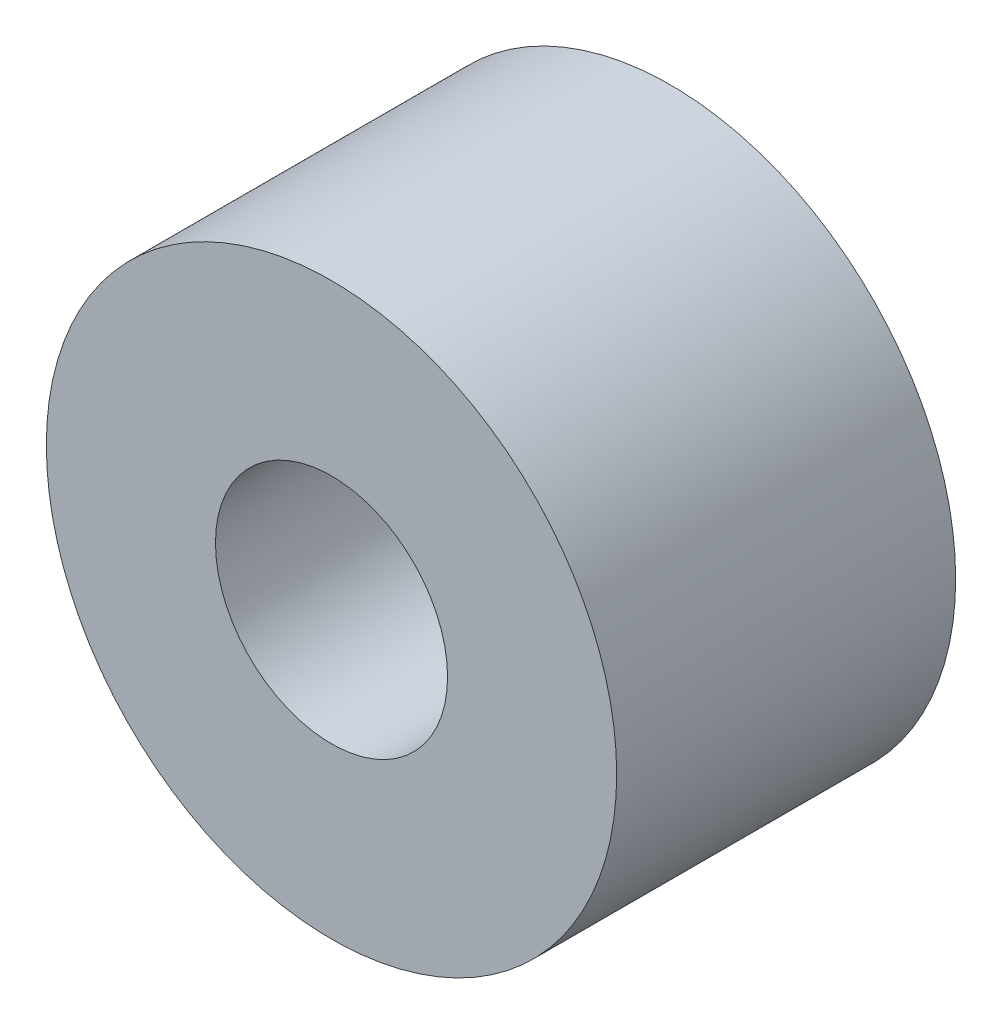
ISO-10303-21;
HEADER;
FILE_DESCRIPTION(('STEP AP214'),'2;1');
FILE_NAME('part.step','',(''),(''),'','','');
FILE_SCHEMA(('AUTOMOTIVE_DESIGN { 1 0 10303 214 1 1 1 1 }'));
ENDSEC;
DATA;
#1=APPLICATION_CONTEXT('core data for automotive mechanical design processes');
#2=APPLICATION_PROTOCOL_DEFINITION('international standard','automotive_design',2000,#1);
#3=PRODUCT_CONTEXT('',#1,'mechanical');
#4=PRODUCT('Part','Part','',(#3));
#5=PRODUCT_RELATED_PRODUCT_CATEGORY('part','',(#4));
#6=PRODUCT_DEFINITION_FORMATION('','',#4);
#7=PRODUCT_DEFINITION_CONTEXT('part definition',#1,'design');
#8=PRODUCT_DEFINITION('design','',#6,#7);
#9=PRODUCT_DEFINITION_SHAPE('','',#8);
#10=(LENGTH_UNIT() NAMED_UNIT(*) SI_UNIT(.MILLI.,.METRE.));
#11=(NAMED_UNIT(*) PLANE_ANGLE_UNIT() SI_UNIT($,.RADIAN.));
#12=(NAMED_UNIT(*) SI_UNIT($,.STERADIAN.) SOLID_ANGLE_UNIT());
#13=UNCERTAINTY_MEASURE_WITH_UNIT(LENGTH_MEASURE(1.E-05),#10,'distance_accuracy_value','');
#14=(GEOMETRIC_REPRESENTATION_CONTEXT(3) GLOBAL_UNCERTAINTY_ASSIGNED_CONTEXT((#13)) GLOBAL_UNIT_ASSIGNED_CONTEXT((#10,
#11,#12)) REPRESENTATION_CONTEXT('',''));
#15=CARTESIAN_POINT('',(0.,0.,0.));
#16=DIRECTION('',(0.,0.,1.));
#17=DIRECTION('',(1.,0.,0.));
#18=AXIS2_PLACEMENT_3D('',#15,#16,#17);
#19=CARTESIAN_POINT('',(0.,0.,9.01700000000009));
#20=DIRECTION('',(0.,0.,-1.));
#21=DIRECTION('',(-1.,0.,0.));
#22=AXIS2_PLACEMENT_3D('',#19,#20,#21);
#23=CYLINDRICAL_SURFACE('',#22,2.);
#24=CARTESIAN_POINT('',(0.,0.,9.01700000000009));
#25=DIRECTION('',(0.,0.,1.));
#26=DIRECTION('',(1.,0.,0.));
#27=AXIS2_PLACEMENT_3D('',#24,#25,#26);
#28=CIRCLE('',#27,2.);
#29=CARTESIAN_POINT('',(2.,0.,9.01700000000009));
#30=VERTEX_POINT('',#29);
#31=EDGE_CURVE('E40',#30,#30,#28,.T.);
#32=ORIENTED_EDGE('',*,*,#31,.T.);
#33=EDGE_LOOP('',(#32));
#34=FACE_BOUND('',#33,.T.);
#35=CARTESIAN_POINT('',(0.,0.,3.17500000000009));
#36=DIRECTION('',(0.,0.,1.));
#37=DIRECTION('',(1.,0.,0.));
#38=AXIS2_PLACEMENT_3D('',#35,#36,#37);
#39=CIRCLE('',#38,2.);
#40=CARTESIAN_POINT('',(2.,0.,3.17500000000009));
#41=VERTEX_POINT('',#40);
#42=EDGE_CURVE('E46',#41,#41,#39,.T.);
#43=ORIENTED_EDGE('',*,*,#42,.F.);
#44=EDGE_LOOP('',(#43));
#45=FACE_BOUND('',#44,.T.);
#46=ADVANCED_FACE('F33',(#34,#45),#23,.F.);
#47=CARTESIAN_POINT('',(0.,0.,9.01700000000009));
#48=DIRECTION('',(0.,0.,-1.));
#49=DIRECTION('',(-1.,0.,0.));
#50=AXIS2_PLACEMENT_3D('',#47,#48,#49);
#51=CYLINDRICAL_SURFACE('',#50,4.915);
#52=CARTESIAN_POINT('',(0.,0.,9.01700000000009));
#53=DIRECTION('',(0.,0.,1.));
#54=DIRECTION('',(1.,0.,0.));
#55=AXIS2_PLACEMENT_3D('',#52,#53,#54);
#56=CIRCLE('',#55,4.915);
#57=CARTESIAN_POINT('',(4.915,0.,9.01700000000009));
#58=VERTEX_POINT('',#57);
#59=EDGE_CURVE('E10',#58,#58,#56,.T.);
#60=ORIENTED_EDGE('',*,*,#59,.F.);
#61=EDGE_LOOP('',(#60));
#62=FACE_BOUND('',#61,.T.);
#63=CARTESIAN_POINT('',(0.,0.,3.17500000000009));
#64=DIRECTION('',(0.,0.,1.));
#65=DIRECTION('',(1.,0.,0.));
#66=AXIS2_PLACEMENT_3D('',#63,#64,#65);
#67=CIRCLE('',#66,4.915);
#68=CARTESIAN_POINT('',(4.915,0.,3.17500000000009));
#69=VERTEX_POINT('',#68);
#70=EDGE_CURVE('E36',#69,#69,#67,.T.);
#71=ORIENTED_EDGE('',*,*,#70,.T.);
#72=EDGE_LOOP('',(#71));
#73=FACE_BOUND('',#72,.T.);
#74=ADVANCED_FACE('F53',(#62,#73),#51,.T.);
#75=CARTESIAN_POINT('',(0.,0.,9.01700000000009));
#76=DIRECTION('',(0.,0.,1.));
#77=DIRECTION('',(1.,0.,0.));
#78=AXIS2_PLACEMENT_3D('',#75,#76,#77);
#79=PLANE('',#78);
#80=ORIENTED_EDGE('',*,*,#31,.F.);
#81=EDGE_LOOP('',(#80));
#82=FACE_BOUND('',#81,.T.);
#83=ORIENTED_EDGE('',*,*,#59,.T.);
#84=EDGE_LOOP('',(#83));
#85=FACE_BOUND('',#84,.T.);
#86=ADVANCED_FACE('F57',(#82,#85),#79,.T.);
#87=CARTESIAN_POINT('',(0.,0.,3.17500000000009));
#88=DIRECTION('',(0.,0.,1.));
#89=DIRECTION('',(1.,0.,0.));
#90=AXIS2_PLACEMENT_3D('',#87,#88,#89);
#91=PLANE('',#90);
#92=ORIENTED_EDGE('',*,*,#42,.T.);
#93=EDGE_LOOP('',(#92));
#94=FACE_BOUND('',#93,.T.);
#95=ORIENTED_EDGE('',*,*,#70,.F.);
#96=EDGE_LOOP('',(#95));
#97=FACE_BOUND('',#96,.T.);
#98=ADVANCED_FACE('F55',(#94,#97),#91,.F.);
#99=CLOSED_SHELL('',(#46,#74,#86,#98));
#100=MANIFOLD_SOLID_BREP('B2',#99);
#101=ADVANCED_BREP_SHAPE_REPRESENTATION('',(#18,#100),#14);
#102=SHAPE_DEFINITION_REPRESENTATION(#9,#101);
ENDSEC;
END-ISO-10303-21;
